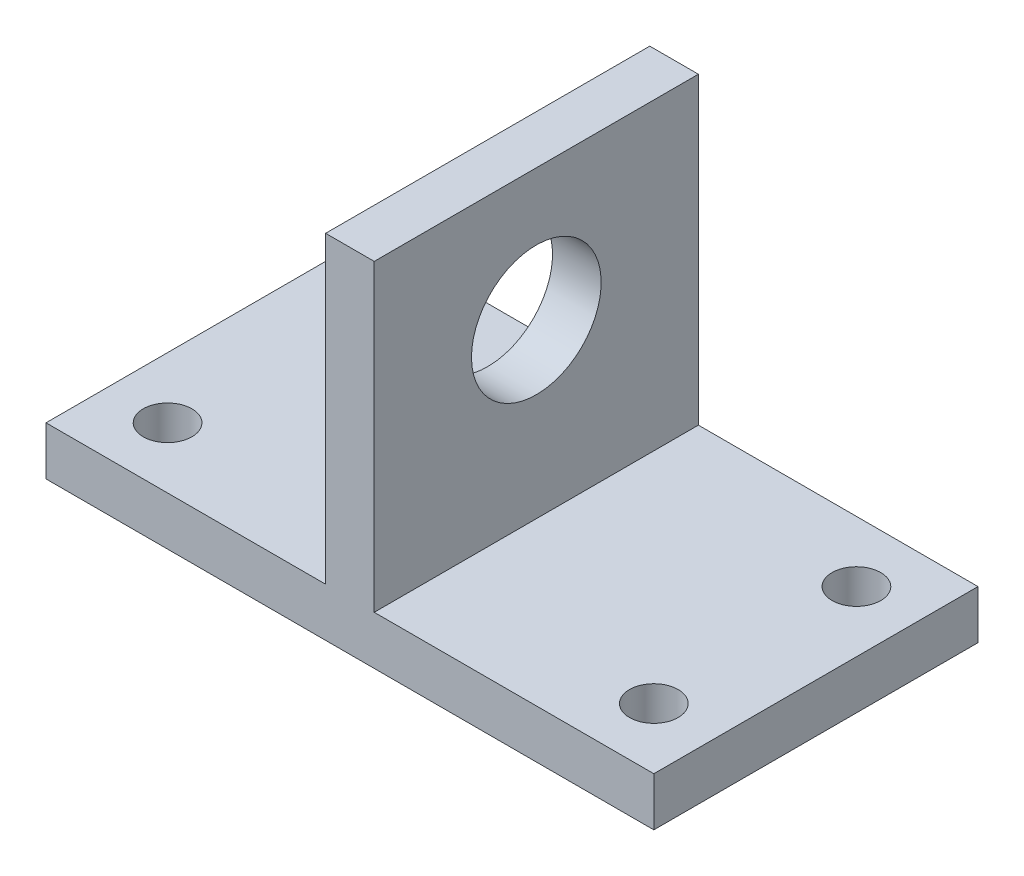
ISO-10303-21;
HEADER;
FILE_DESCRIPTION(('STEP AP214'),'2;1');
FILE_NAME('part.step','',(''),(''),'','','');
FILE_SCHEMA(('AUTOMOTIVE_DESIGN { 1 0 10303 214 1 1 1 1 }'));
ENDSEC;
DATA;
#1=APPLICATION_CONTEXT('core data for automotive mechanical design processes');
#2=APPLICATION_PROTOCOL_DEFINITION('international standard','automotive_design',2000,#1);
#3=PRODUCT_CONTEXT('',#1,'mechanical');
#4=PRODUCT('Part','Part','',(#3));
#5=PRODUCT_RELATED_PRODUCT_CATEGORY('part','',(#4));
#6=PRODUCT_DEFINITION_FORMATION('','',#4);
#7=PRODUCT_DEFINITION_CONTEXT('part definition',#1,'design');
#8=PRODUCT_DEFINITION('design','',#6,#7);
#9=PRODUCT_DEFINITION_SHAPE('','',#8);
#10=(LENGTH_UNIT() NAMED_UNIT(*) SI_UNIT(.MILLI.,.METRE.));
#11=(NAMED_UNIT(*) PLANE_ANGLE_UNIT() SI_UNIT($,.RADIAN.));
#12=(NAMED_UNIT(*) SI_UNIT($,.STERADIAN.) SOLID_ANGLE_UNIT());
#13=UNCERTAINTY_MEASURE_WITH_UNIT(LENGTH_MEASURE(1.E-05),#10,'distance_accuracy_value','');
#14=(GEOMETRIC_REPRESENTATION_CONTEXT(3) GLOBAL_UNCERTAINTY_ASSIGNED_CONTEXT((#13)) GLOBAL_UNIT_ASSIGNED_CONTEXT((#10,
#11,#12)) REPRESENTATION_CONTEXT('',''));
#15=CARTESIAN_POINT('',(0.,0.,0.));
#16=DIRECTION('',(0.,0.,1.));
#17=DIRECTION('',(1.,0.,0.));
#18=AXIS2_PLACEMENT_3D('',#15,#16,#17);
#19=CARTESIAN_POINT('',(0.,12.,0.));
#20=DIRECTION('',(0.,1.,0.));
#21=DIRECTION('',(0.,0.,1.));
#22=AXIS2_PLACEMENT_3D('',#19,#20,#21);
#23=PLANE('',#22);
#24=DIRECTION('',(0.,0.,-1.));
#25=VECTOR('',#24,1.);
#26=CARTESIAN_POINT('',(6.,12.,-40.));
#27=LINE('',#26,#25);
#28=CARTESIAN_POINT('',(6.00000000000001,12.,40.));
#29=VERTEX_POINT('',#28);
#30=CARTESIAN_POINT('',(6.00000000000001,12.,-40.));
#31=VERTEX_POINT('',#30);
#32=EDGE_CURVE('E70',#29,#31,#27,.T.);
#33=ORIENTED_EDGE('',*,*,#32,.F.);
#34=DIRECTION('',(1.,0.,0.));
#35=VECTOR('',#34,1.);
#36=CARTESIAN_POINT('',(-75.,12.,40.));
#37=LINE('',#36,#35);
#38=CARTESIAN_POINT('',(75.,12.,40.));
#39=VERTEX_POINT('',#38);
#40=EDGE_CURVE('E190',#29,#39,#37,.T.);
#41=ORIENTED_EDGE('',*,*,#40,.T.);
#42=DIRECTION('',(0.,0.,-1.));
#43=VECTOR('',#42,1.);
#44=CARTESIAN_POINT('',(75.,12.,-40.));
#45=LINE('',#44,#43);
#46=CARTESIAN_POINT('',(75.,12.,-40.));
#47=VERTEX_POINT('',#46);
#48=EDGE_CURVE('E173',#39,#47,#45,.T.);
#49=ORIENTED_EDGE('',*,*,#48,.T.);
#50=DIRECTION('',(-1.,0.,0.));
#51=VECTOR('',#50,1.);
#52=CARTESIAN_POINT('',(-75.,12.,-40.));
#53=LINE('',#52,#51);
#54=EDGE_CURVE('E182',#47,#31,#53,.T.);
#55=ORIENTED_EDGE('',*,*,#54,.T.);
#56=EDGE_LOOP('',(#33,#41,#49,#55));
#57=FACE_BOUND('',#56,.T.);
#58=CARTESIAN_POINT('',(60.,12.,25.));
#59=DIRECTION('',(0.,1.,0.));
#60=DIRECTION('',(0.,0.,1.));
#61=AXIS2_PLACEMENT_3D('',#58,#59,#60);
#62=CIRCLE('',#61,6.);
#63=CARTESIAN_POINT('',(60.,12.,31.));
#64=VERTEX_POINT('',#63);
#65=EDGE_CURVE('E151',#64,#64,#62,.T.);
#66=ORIENTED_EDGE('',*,*,#65,.F.);
#67=EDGE_LOOP('',(#66));
#68=FACE_BOUND('',#67,.T.);
#69=CARTESIAN_POINT('',(60.,12.,-25.));
#70=DIRECTION('',(0.,1.,0.));
#71=DIRECTION('',(0.,0.,1.));
#72=AXIS2_PLACEMENT_3D('',#69,#70,#71);
#73=CIRCLE('',#72,5.99999999999999);
#74=CARTESIAN_POINT('',(60.,12.,-19.));
#75=VERTEX_POINT('',#74);
#76=EDGE_CURVE('E203',#75,#75,#73,.T.);
#77=ORIENTED_EDGE('',*,*,#76,.F.);
#78=EDGE_LOOP('',(#77));
#79=FACE_BOUND('',#78,.T.);
#80=ADVANCED_FACE('F54',(#57,#68,#79),#23,.T.);
#81=DIRECTION('',(0.,0.,1.));
#82=VECTOR('',#81,1.);
#83=CARTESIAN_POINT('',(-6.,12.,-40.));
#84=LINE('',#83,#82);
#85=CARTESIAN_POINT('',(-6.00000000000001,12.,-40.));
#86=VERTEX_POINT('',#85);
#87=CARTESIAN_POINT('',(-6.,12.,40.));
#88=VERTEX_POINT('',#87);
#89=EDGE_CURVE('E78',#86,#88,#84,.T.);
#90=ORIENTED_EDGE('',*,*,#89,.F.);
#91=CARTESIAN_POINT('',(-75.,12.,-40.));
#92=VERTEX_POINT('',#91);
#93=EDGE_CURVE('E177',#86,#92,#53,.T.);
#94=ORIENTED_EDGE('',*,*,#93,.T.);
#95=DIRECTION('',(0.,0.,1.));
#96=VECTOR('',#95,1.);
#97=CARTESIAN_POINT('',(-75.,12.,-40.));
#98=LINE('',#97,#96);
#99=CARTESIAN_POINT('',(-75.,12.,40.));
#100=VERTEX_POINT('',#99);
#101=EDGE_CURVE('E186',#92,#100,#98,.T.);
#102=ORIENTED_EDGE('',*,*,#101,.T.);
#103=EDGE_CURVE('E191',#100,#88,#37,.T.);
#104=ORIENTED_EDGE('',*,*,#103,.T.);
#105=EDGE_LOOP('',(#90,#94,#102,#104));
#106=FACE_BOUND('',#105,.T.);
#107=CARTESIAN_POINT('',(-60.,12.,-25.));
#108=DIRECTION('',(0.,1.,0.));
#109=DIRECTION('',(0.,0.,1.));
#110=AXIS2_PLACEMENT_3D('',#107,#108,#109);
#111=CIRCLE('',#110,6.00000000000001);
#112=CARTESIAN_POINT('',(-60.,12.,-19.));
#113=VERTEX_POINT('',#112);
#114=EDGE_CURVE('E290',#113,#113,#111,.T.);
#115=ORIENTED_EDGE('',*,*,#114,.F.);
#116=EDGE_LOOP('',(#115));
#117=FACE_BOUND('',#116,.T.);
#118=CARTESIAN_POINT('',(-60.,12.,25.));
#119=DIRECTION('',(0.,1.,0.));
#120=DIRECTION('',(0.,0.,1.));
#121=AXIS2_PLACEMENT_3D('',#118,#119,#120);
#122=CIRCLE('',#121,6.00000000000001);
#123=CARTESIAN_POINT('',(-60.,12.,31.));
#124=VERTEX_POINT('',#123);
#125=EDGE_CURVE('E205',#124,#124,#122,.T.);
#126=ORIENTED_EDGE('',*,*,#125,.F.);
#127=EDGE_LOOP('',(#126));
#128=FACE_BOUND('',#127,.T.);
#129=ADVANCED_FACE('F333',(#106,#117,#128),#23,.T.);
#130=CARTESIAN_POINT('',(0.,0.,0.));
#131=DIRECTION('',(0.,1.,0.));
#132=DIRECTION('',(0.,0.,1.));
#133=AXIS2_PLACEMENT_3D('',#130,#131,#132);
#134=PLANE('',#133);
#135=DIRECTION('',(0.,0.,-1.));
#136=VECTOR('',#135,1.);
#137=CARTESIAN_POINT('',(75.,0.,-40.));
#138=LINE('',#137,#136);
#139=CARTESIAN_POINT('',(75.,0.,40.));
#140=VERTEX_POINT('',#139);
#141=CARTESIAN_POINT('',(75.,0.,-40.));
#142=VERTEX_POINT('',#141);
#143=EDGE_CURVE('E286',#140,#142,#138,.T.);
#144=ORIENTED_EDGE('',*,*,#143,.F.);
#145=DIRECTION('',(1.,0.,0.));
#146=VECTOR('',#145,1.);
#147=CARTESIAN_POINT('',(-75.,0.,40.));
#148=LINE('',#147,#146);
#149=CARTESIAN_POINT('',(-75.,0.,40.));
#150=VERTEX_POINT('',#149);
#151=EDGE_CURVE('E178',#150,#140,#148,.T.);
#152=ORIENTED_EDGE('',*,*,#151,.F.);
#153=DIRECTION('',(0.,0.,1.));
#154=VECTOR('',#153,1.);
#155=CARTESIAN_POINT('',(-75.,0.,-40.));
#156=LINE('',#155,#154);
#157=CARTESIAN_POINT('',(-75.,0.,-40.));
#158=VERTEX_POINT('',#157);
#159=EDGE_CURVE('E275',#158,#150,#156,.T.);
#160=ORIENTED_EDGE('',*,*,#159,.F.);
#161=DIRECTION('',(-1.,0.,0.));
#162=VECTOR('',#161,1.);
#163=CARTESIAN_POINT('',(-75.,0.,-40.));
#164=LINE('',#163,#162);
#165=EDGE_CURVE('E280',#142,#158,#164,.T.);
#166=ORIENTED_EDGE('',*,*,#165,.F.);
#167=EDGE_LOOP('',(#144,#152,#160,#166));
#168=FACE_BOUND('',#167,.T.);
#169=CARTESIAN_POINT('',(-60.,0.,-25.));
#170=DIRECTION('',(0.,1.,0.));
#171=DIRECTION('',(0.,0.,1.));
#172=AXIS2_PLACEMENT_3D('',#169,#170,#171);
#173=CIRCLE('',#172,6.00000000000001);
#174=CARTESIAN_POINT('',(-60.,0.,-19.));
#175=VERTEX_POINT('',#174);
#176=EDGE_CURVE('E179',#175,#175,#173,.T.);
#177=ORIENTED_EDGE('',*,*,#176,.T.);
#178=EDGE_LOOP('',(#177));
#179=FACE_BOUND('',#178,.T.);
#180=CARTESIAN_POINT('',(-60.,0.,25.));
#181=DIRECTION('',(0.,1.,0.));
#182=DIRECTION('',(0.,0.,1.));
#183=AXIS2_PLACEMENT_3D('',#180,#181,#182);
#184=CIRCLE('',#183,6.00000000000001);
#185=CARTESIAN_POINT('',(-60.,0.,31.));
#186=VERTEX_POINT('',#185);
#187=EDGE_CURVE('E210',#186,#186,#184,.T.);
#188=ORIENTED_EDGE('',*,*,#187,.T.);
#189=EDGE_LOOP('',(#188));
#190=FACE_BOUND('',#189,.T.);
#191=CARTESIAN_POINT('',(60.,0.,-25.));
#192=DIRECTION('',(0.,1.,0.));
#193=DIRECTION('',(0.,0.,1.));
#194=AXIS2_PLACEMENT_3D('',#191,#192,#193);
#195=CIRCLE('',#194,5.99999999999999);
#196=CARTESIAN_POINT('',(60.,0.,-19.));
#197=VERTEX_POINT('',#196);
#198=EDGE_CURVE('E161',#197,#197,#195,.T.);
#199=ORIENTED_EDGE('',*,*,#198,.T.);
#200=EDGE_LOOP('',(#199));
#201=FACE_BOUND('',#200,.T.);
#202=CARTESIAN_POINT('',(60.,0.,25.));
#203=DIRECTION('',(0.,1.,0.));
#204=DIRECTION('',(0.,0.,1.));
#205=AXIS2_PLACEMENT_3D('',#202,#203,#204);
#206=CIRCLE('',#205,6.);
#207=CARTESIAN_POINT('',(60.,0.,31.));
#208=VERTEX_POINT('',#207);
#209=EDGE_CURVE('E144',#208,#208,#206,.T.);
#210=ORIENTED_EDGE('',*,*,#209,.T.);
#211=EDGE_LOOP('',(#210));
#212=FACE_BOUND('',#211,.T.);
#213=ADVANCED_FACE('F278',(#168,#179,#190,#201,#212),#134,.F.);
#214=CARTESIAN_POINT('',(75.,12.,-40.));
#215=DIRECTION('',(-1.,0.,0.));
#216=DIRECTION('',(0.,0.,1.));
#217=AXIS2_PLACEMENT_3D('',#214,#215,#216);
#218=PLANE('',#217);
#219=ORIENTED_EDGE('',*,*,#143,.T.);
#220=DIRECTION('',(0.,-1.,0.));
#221=VECTOR('',#220,1.);
#222=CARTESIAN_POINT('',(75.,12.,-40.));
#223=LINE('',#222,#221);
#224=EDGE_CURVE('E12',#47,#142,#223,.T.);
#225=ORIENTED_EDGE('',*,*,#224,.F.);
#226=ORIENTED_EDGE('',*,*,#48,.F.);
#227=DIRECTION('',(0.,-1.,0.));
#228=VECTOR('',#227,1.);
#229=CARTESIAN_POINT('',(75.,12.,40.));
#230=LINE('',#229,#228);
#231=EDGE_CURVE('E245',#39,#140,#230,.T.);
#232=ORIENTED_EDGE('',*,*,#231,.T.);
#233=EDGE_LOOP('',(#219,#225,#226,#232));
#234=FACE_BOUND('',#233,.T.);
#235=ADVANCED_FACE('F56',(#234),#218,.F.);
#236=CARTESIAN_POINT('',(-75.,12.,-40.));
#237=DIRECTION('',(0.,0.,1.));
#238=DIRECTION('',(1.,0.,0.));
#239=AXIS2_PLACEMENT_3D('',#236,#237,#238);
#240=PLANE('',#239);
#241=ORIENTED_EDGE('',*,*,#165,.T.);
#242=DIRECTION('',(0.,-1.,0.));
#243=VECTOR('',#242,1.);
#244=CARTESIAN_POINT('',(-75.,12.,-40.));
#245=LINE('',#244,#243);
#246=EDGE_CURVE('E63',#92,#158,#245,.T.);
#247=ORIENTED_EDGE('',*,*,#246,.F.);
#248=ORIENTED_EDGE('',*,*,#93,.F.);
#249=DIRECTION('',(0.,-1.,0.));
#250=VECTOR('',#249,1.);
#251=CARTESIAN_POINT('',(-6.,87.,-40.));
#252=LINE('',#251,#250);
#253=CARTESIAN_POINT('',(-6.,87.,-40.));
#254=VERTEX_POINT('',#253);
#255=EDGE_CURVE('E126',#254,#86,#252,.T.);
#256=ORIENTED_EDGE('',*,*,#255,.F.);
#257=DIRECTION('',(-1.,0.,0.));
#258=VECTOR('',#257,1.);
#259=CARTESIAN_POINT('',(-6.,87.,-40.));
#260=LINE('',#259,#258);
#261=CARTESIAN_POINT('',(6.,87.,-40.));
#262=VERTEX_POINT('',#261);
#263=EDGE_CURVE('E120',#262,#254,#260,.T.);
#264=ORIENTED_EDGE('',*,*,#263,.F.);
#265=DIRECTION('',(0.,-1.,0.));
#266=VECTOR('',#265,1.);
#267=CARTESIAN_POINT('',(6.,87.,-40.));
#268=LINE('',#267,#266);
#269=EDGE_CURVE('E124',#262,#31,#268,.T.);
#270=ORIENTED_EDGE('',*,*,#269,.T.);
#271=ORIENTED_EDGE('',*,*,#54,.F.);
#272=ORIENTED_EDGE('',*,*,#224,.T.);
#273=EDGE_LOOP('',(#241,#247,#248,#256,#264,#270,#271,#272));
#274=FACE_BOUND('',#273,.T.);
#275=ADVANCED_FACE('F122',(#274),#240,.F.);
#276=CARTESIAN_POINT('',(-75.,12.,-40.));
#277=DIRECTION('',(1.,0.,0.));
#278=DIRECTION('',(0.,0.,-1.));
#279=AXIS2_PLACEMENT_3D('',#276,#277,#278);
#280=PLANE('',#279);
#281=ORIENTED_EDGE('',*,*,#159,.T.);
#282=DIRECTION('',(0.,-1.,0.));
#283=VECTOR('',#282,1.);
#284=CARTESIAN_POINT('',(-75.,12.,40.));
#285=LINE('',#284,#283);
#286=EDGE_CURVE('E254',#100,#150,#285,.T.);
#287=ORIENTED_EDGE('',*,*,#286,.F.);
#288=ORIENTED_EDGE('',*,*,#101,.F.);
#289=ORIENTED_EDGE('',*,*,#246,.T.);
#290=EDGE_LOOP('',(#281,#287,#288,#289));
#291=FACE_BOUND('',#290,.T.);
#292=ADVANCED_FACE('F273',(#291),#280,.F.);
#293=CARTESIAN_POINT('',(-75.,12.,40.));
#294=DIRECTION('',(0.,0.,-1.));
#295=DIRECTION('',(-1.,0.,0.));
#296=AXIS2_PLACEMENT_3D('',#293,#294,#295);
#297=PLANE('',#296);
#298=ORIENTED_EDGE('',*,*,#151,.T.);
#299=ORIENTED_EDGE('',*,*,#231,.F.);
#300=ORIENTED_EDGE('',*,*,#40,.F.);
#301=DIRECTION('',(0.,-1.,0.));
#302=VECTOR('',#301,1.);
#303=CARTESIAN_POINT('',(6.,87.,40.));
#304=LINE('',#303,#302);
#305=CARTESIAN_POINT('',(6.,87.,40.));
#306=VERTEX_POINT('',#305);
#307=EDGE_CURVE('E222',#306,#29,#304,.T.);
#308=ORIENTED_EDGE('',*,*,#307,.F.);
#309=DIRECTION('',(1.,0.,0.));
#310=VECTOR('',#309,1.);
#311=CARTESIAN_POINT('',(-6.,87.,40.));
#312=LINE('',#311,#310);
#313=CARTESIAN_POINT('',(-6.,87.,40.));
#314=VERTEX_POINT('',#313);
#315=EDGE_CURVE('E136',#314,#306,#312,.T.);
#316=ORIENTED_EDGE('',*,*,#315,.F.);
#317=DIRECTION('',(0.,-1.,0.));
#318=VECTOR('',#317,1.);
#319=CARTESIAN_POINT('',(-6.,87.,40.));
#320=LINE('',#319,#318);
#321=EDGE_CURVE('E153',#314,#88,#320,.T.);
#322=ORIENTED_EDGE('',*,*,#321,.T.);
#323=ORIENTED_EDGE('',*,*,#103,.F.);
#324=ORIENTED_EDGE('',*,*,#286,.T.);
#325=EDGE_LOOP('',(#298,#299,#300,#308,#316,#322,#323,#324));
#326=FACE_BOUND('',#325,.T.);
#327=ADVANCED_FACE('F242',(#326),#297,.F.);
#328=CARTESIAN_POINT('',(-60.,12.,-25.));
#329=DIRECTION('',(0.,-1.,0.));
#330=DIRECTION('',(0.,0.,-1.));
#331=AXIS2_PLACEMENT_3D('',#328,#329,#330);
#332=CYLINDRICAL_SURFACE('',#331,6.00000000000001);
#333=ORIENTED_EDGE('',*,*,#114,.T.);
#334=EDGE_LOOP('',(#333));
#335=FACE_BOUND('',#334,.T.);
#336=ORIENTED_EDGE('',*,*,#176,.F.);
#337=EDGE_LOOP('',(#336));
#338=FACE_BOUND('',#337,.T.);
#339=ADVANCED_FACE('F341',(#335,#338),#332,.F.);
#340=CARTESIAN_POINT('',(-60.,12.,25.));
#341=DIRECTION('',(0.,-1.,0.));
#342=DIRECTION('',(0.,0.,-1.));
#343=AXIS2_PLACEMENT_3D('',#340,#341,#342);
#344=CYLINDRICAL_SURFACE('',#343,6.00000000000001);
#345=ORIENTED_EDGE('',*,*,#125,.T.);
#346=EDGE_LOOP('',(#345));
#347=FACE_BOUND('',#346,.T.);
#348=ORIENTED_EDGE('',*,*,#187,.F.);
#349=EDGE_LOOP('',(#348));
#350=FACE_BOUND('',#349,.T.);
#351=ADVANCED_FACE('F393',(#347,#350),#344,.F.);
#352=CARTESIAN_POINT('',(60.,12.,-25.));
#353=DIRECTION('',(0.,-1.,0.));
#354=DIRECTION('',(0.,0.,-1.));
#355=AXIS2_PLACEMENT_3D('',#352,#353,#354);
#356=CYLINDRICAL_SURFACE('',#355,5.99999999999999);
#357=ORIENTED_EDGE('',*,*,#76,.T.);
#358=EDGE_LOOP('',(#357));
#359=FACE_BOUND('',#358,.T.);
#360=ORIENTED_EDGE('',*,*,#198,.F.);
#361=EDGE_LOOP('',(#360));
#362=FACE_BOUND('',#361,.T.);
#363=ADVANCED_FACE('F381',(#359,#362),#356,.F.);
#364=CARTESIAN_POINT('',(60.,12.,25.));
#365=DIRECTION('',(0.,-1.,0.));
#366=DIRECTION('',(0.,0.,-1.));
#367=AXIS2_PLACEMENT_3D('',#364,#365,#366);
#368=CYLINDRICAL_SURFACE('',#367,6.);
#369=ORIENTED_EDGE('',*,*,#65,.T.);
#370=EDGE_LOOP('',(#369));
#371=FACE_BOUND('',#370,.T.);
#372=ORIENTED_EDGE('',*,*,#209,.F.);
#373=EDGE_LOOP('',(#372));
#374=FACE_BOUND('',#373,.T.);
#375=ADVANCED_FACE('F329',(#371,#374),#368,.F.);
#376=CARTESIAN_POINT('',(6.,87.,-40.));
#377=DIRECTION('',(-1.,0.,0.));
#378=DIRECTION('',(0.,0.,1.));
#379=AXIS2_PLACEMENT_3D('',#376,#377,#378);
#380=PLANE('',#379);
#381=CARTESIAN_POINT('',(6.00000000000001,54.5,0.));
#382=DIRECTION('',(-1.,0.,0.));
#383=DIRECTION('',(0.,0.,1.));
#384=AXIS2_PLACEMENT_3D('',#381,#382,#383);
#385=CIRCLE('',#384,16.);
#386=CARTESIAN_POINT('',(6.00000000000001,54.5,16.));
#387=VERTEX_POINT('',#386);
#388=EDGE_CURVE('E225',#387,#387,#385,.T.);
#389=ORIENTED_EDGE('',*,*,#388,.T.);
#390=EDGE_LOOP('',(#389));
#391=FACE_BOUND('',#390,.T.);
#392=ORIENTED_EDGE('',*,*,#32,.T.);
#393=ORIENTED_EDGE('',*,*,#269,.F.);
#394=DIRECTION('',(0.,0.,-1.));
#395=VECTOR('',#394,1.);
#396=CARTESIAN_POINT('',(6.,87.,-40.));
#397=LINE('',#396,#395);
#398=EDGE_CURVE('E131',#306,#262,#397,.T.);
#399=ORIENTED_EDGE('',*,*,#398,.F.);
#400=ORIENTED_EDGE('',*,*,#307,.T.);
#401=EDGE_LOOP('',(#392,#393,#399,#400));
#402=FACE_BOUND('',#401,.T.);
#403=ADVANCED_FACE('F142',(#391,#402),#380,.F.);
#404=CARTESIAN_POINT('',(-6.,87.,-40.));
#405=DIRECTION('',(1.,0.,0.));
#406=DIRECTION('',(0.,0.,-1.));
#407=AXIS2_PLACEMENT_3D('',#404,#405,#406);
#408=PLANE('',#407);
#409=CARTESIAN_POINT('',(-6.,54.5,0.));
#410=DIRECTION('',(-1.,0.,0.));
#411=DIRECTION('',(0.,0.,1.));
#412=AXIS2_PLACEMENT_3D('',#409,#410,#411);
#413=CIRCLE('',#412,16.);
#414=CARTESIAN_POINT('',(-6.,54.5,16.));
#415=VERTEX_POINT('',#414);
#416=EDGE_CURVE('E309',#415,#415,#413,.T.);
#417=ORIENTED_EDGE('',*,*,#416,.F.);
#418=EDGE_LOOP('',(#417));
#419=FACE_BOUND('',#418,.T.);
#420=ORIENTED_EDGE('',*,*,#89,.T.);
#421=ORIENTED_EDGE('',*,*,#321,.F.);
#422=DIRECTION('',(0.,0.,1.));
#423=VECTOR('',#422,1.);
#424=CARTESIAN_POINT('',(-6.,87.,-40.));
#425=LINE('',#424,#423);
#426=EDGE_CURVE('E130',#254,#314,#425,.T.);
#427=ORIENTED_EDGE('',*,*,#426,.F.);
#428=ORIENTED_EDGE('',*,*,#255,.T.);
#429=EDGE_LOOP('',(#420,#421,#427,#428));
#430=FACE_BOUND('',#429,.T.);
#431=ADVANCED_FACE('F320',(#419,#430),#408,.F.);
#432=CARTESIAN_POINT('',(0.,87.,0.));
#433=DIRECTION('',(0.,1.,0.));
#434=DIRECTION('',(0.,0.,1.));
#435=AXIS2_PLACEMENT_3D('',#432,#433,#434);
#436=PLANE('',#435);
#437=ORIENTED_EDGE('',*,*,#398,.T.);
#438=ORIENTED_EDGE('',*,*,#263,.T.);
#439=ORIENTED_EDGE('',*,*,#426,.T.);
#440=ORIENTED_EDGE('',*,*,#315,.T.);
#441=EDGE_LOOP('',(#437,#438,#439,#440));
#442=FACE_BOUND('',#441,.T.);
#443=ADVANCED_FACE('F134',(#442),#436,.T.);
#444=CARTESIAN_POINT('',(75.,54.5,0.));
#445=DIRECTION('',(-1.,0.,0.));
#446=DIRECTION('',(0.,0.,1.));
#447=AXIS2_PLACEMENT_3D('',#444,#445,#446);
#448=CYLINDRICAL_SURFACE('',#447,16.);
#449=ORIENTED_EDGE('',*,*,#416,.T.);
#450=EDGE_LOOP('',(#449));
#451=FACE_BOUND('',#450,.T.);
#452=ORIENTED_EDGE('',*,*,#388,.F.);
#453=EDGE_LOOP('',(#452));
#454=FACE_BOUND('',#453,.T.);
#455=ADVANCED_FACE('F317',(#451,#454),#448,.F.);
#456=CLOSED_SHELL('',(#80,#129,#213,#235,#275,#292,#327,#339,#351,#363,#375,#403,#431,#443,#455));
#457=MANIFOLD_SOLID_BREP('B2',#456);
#458=ADVANCED_BREP_SHAPE_REPRESENTATION('',(#18,#457),#14);
#459=SHAPE_DEFINITION_REPRESENTATION(#9,#458);
ENDSEC;
END-ISO-10303-21;
